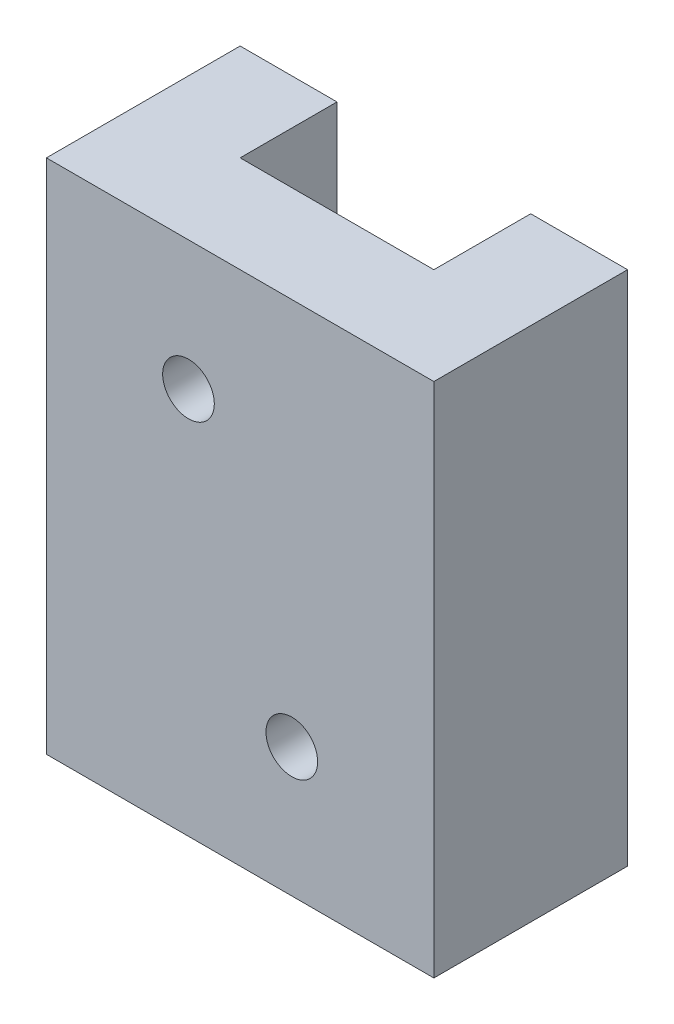
ISO-10303-21;
HEADER;
FILE_DESCRIPTION(('STEP AP214'),'2;1');
FILE_NAME('part.step','',(''),(''),'','','');
FILE_SCHEMA(('AUTOMOTIVE_DESIGN { 1 0 10303 214 1 1 1 1 }'));
ENDSEC;
DATA;
#1=APPLICATION_CONTEXT('core data for automotive mechanical design processes');
#2=APPLICATION_PROTOCOL_DEFINITION('international standard','automotive_design',2000,#1);
#3=PRODUCT_CONTEXT('',#1,'mechanical');
#4=PRODUCT('Part','Part','',(#3));
#5=PRODUCT_RELATED_PRODUCT_CATEGORY('part','',(#4));
#6=PRODUCT_DEFINITION_FORMATION('','',#4);
#7=PRODUCT_DEFINITION_CONTEXT('part definition',#1,'design');
#8=PRODUCT_DEFINITION('design','',#6,#7);
#9=PRODUCT_DEFINITION_SHAPE('','',#8);
#10=(LENGTH_UNIT() NAMED_UNIT(*) SI_UNIT(.MILLI.,.METRE.));
#11=(NAMED_UNIT(*) PLANE_ANGLE_UNIT() SI_UNIT($,.RADIAN.));
#12=(NAMED_UNIT(*) SI_UNIT($,.STERADIAN.) SOLID_ANGLE_UNIT());
#13=UNCERTAINTY_MEASURE_WITH_UNIT(LENGTH_MEASURE(1.E-05),#10,'distance_accuracy_value','');
#14=(GEOMETRIC_REPRESENTATION_CONTEXT(3) GLOBAL_UNCERTAINTY_ASSIGNED_CONTEXT((#13)) GLOBAL_UNIT_ASSIGNED_CONTEXT((#10,
#11,#12)) REPRESENTATION_CONTEXT('',''));
#15=CARTESIAN_POINT('',(0.,0.,0.));
#16=DIRECTION('',(0.,0.,1.));
#17=DIRECTION('',(1.,0.,0.));
#18=AXIS2_PLACEMENT_3D('',#15,#16,#17);
#19=CARTESIAN_POINT('',(0.,0.,0.));
#20=DIRECTION('',(0.,0.,1.));
#21=DIRECTION('',(1.,0.,0.));
#22=AXIS2_PLACEMENT_3D('',#19,#20,#21);
#23=PLANE('',#22);
#24=CARTESIAN_POINT('',(-2.,15.,0.));
#25=DIRECTION('',(0.,0.,1.));
#26=DIRECTION('',(1.,0.,0.));
#27=AXIS2_PLACEMENT_3D('',#24,#25,#26);
#28=CIRCLE('',#27,1.);
#29=CARTESIAN_POINT('',(-1.,15.,0.));
#30=VERTEX_POINT('',#29);
#31=EDGE_CURVE('E149',#30,#30,#28,.T.);
#32=ORIENTED_EDGE('',*,*,#31,.T.);
#33=EDGE_LOOP('',(#32));
#34=FACE_BOUND('',#33,.T.);
#35=CARTESIAN_POINT('',(2.,5.,0.));
#36=DIRECTION('',(0.,0.,1.));
#37=DIRECTION('',(1.,0.,0.));
#38=AXIS2_PLACEMENT_3D('',#35,#36,#37);
#39=CIRCLE('',#38,1.);
#40=CARTESIAN_POINT('',(3.,5.,0.));
#41=VERTEX_POINT('',#40);
#42=EDGE_CURVE('E199',#41,#41,#39,.T.);
#43=ORIENTED_EDGE('',*,*,#42,.T.);
#44=EDGE_LOOP('',(#43));
#45=FACE_BOUND('',#44,.T.);
#46=DIRECTION('',(0.,-1.,0.));
#47=VECTOR('',#46,1.);
#48=CARTESIAN_POINT('',(-3.75,20.,0.));
#49=LINE('',#48,#47);
#50=CARTESIAN_POINT('',(-3.75,20.,0.));
#51=VERTEX_POINT('',#50);
#52=CARTESIAN_POINT('',(-3.75,0.,0.));
#53=VERTEX_POINT('',#52);
#54=EDGE_CURVE('E68',#51,#53,#49,.T.);
#55=ORIENTED_EDGE('',*,*,#54,.F.);
#56=DIRECTION('',(1.,0.,0.));
#57=VECTOR('',#56,1.);
#58=CARTESIAN_POINT('',(0.,20.,0.));
#59=LINE('',#58,#57);
#60=CARTESIAN_POINT('',(3.75,20.,0.));
#61=VERTEX_POINT('',#60);
#62=EDGE_CURVE('E203',#51,#61,#59,.T.);
#63=ORIENTED_EDGE('',*,*,#62,.T.);
#64=DIRECTION('',(0.,1.,0.));
#65=VECTOR('',#64,1.);
#66=CARTESIAN_POINT('',(3.75,20.,0.));
#67=LINE('',#66,#65);
#68=CARTESIAN_POINT('',(3.75,0.,0.));
#69=VERTEX_POINT('',#68);
#70=EDGE_CURVE('E63',#69,#61,#67,.T.);
#71=ORIENTED_EDGE('',*,*,#70,.F.);
#72=DIRECTION('',(1.,0.,0.));
#73=VECTOR('',#72,1.);
#74=CARTESIAN_POINT('',(0.,0.,0.));
#75=LINE('',#74,#73);
#76=EDGE_CURVE('E179',#53,#69,#75,.T.);
#77=ORIENTED_EDGE('',*,*,#76,.F.);
#78=EDGE_LOOP('',(#55,#63,#71,#77));
#79=FACE_BOUND('',#78,.T.);
#80=ADVANCED_FACE('F47',(#34,#45,#79),#23,.F.);
#81=CARTESIAN_POINT('',(0.,20.,3.75));
#82=DIRECTION('',(0.,1.,0.));
#83=DIRECTION('',(0.,0.,1.));
#84=AXIS2_PLACEMENT_3D('',#81,#82,#83);
#85=PLANE('',#84);
#86=ORIENTED_EDGE('',*,*,#62,.F.);
#87=DIRECTION('',(0.,0.,1.));
#88=VECTOR('',#87,1.);
#89=CARTESIAN_POINT('',(-3.75,20.,-3.75));
#90=LINE('',#89,#88);
#91=CARTESIAN_POINT('',(-3.75,20.,-3.75));
#92=VERTEX_POINT('',#91);
#93=EDGE_CURVE('E124',#92,#51,#90,.T.);
#94=ORIENTED_EDGE('',*,*,#93,.F.);
#95=DIRECTION('',(1.,0.,0.));
#96=VECTOR('',#95,1.);
#97=CARTESIAN_POINT('',(-7.5,20.,-3.75));
#98=LINE('',#97,#96);
#99=CARTESIAN_POINT('',(-7.5,20.,-3.75));
#100=VERTEX_POINT('',#99);
#101=EDGE_CURVE('E121',#100,#92,#98,.T.);
#102=ORIENTED_EDGE('',*,*,#101,.F.);
#103=DIRECTION('',(0.,0.,-1.));
#104=VECTOR('',#103,1.);
#105=CARTESIAN_POINT('',(-7.5,20.,3.75));
#106=LINE('',#105,#104);
#107=CARTESIAN_POINT('',(-7.5,20.,3.75));
#108=VERTEX_POINT('',#107);
#109=EDGE_CURVE('E11',#108,#100,#106,.T.);
#110=ORIENTED_EDGE('',*,*,#109,.F.);
#111=DIRECTION('',(1.,0.,0.));
#112=VECTOR('',#111,1.);
#113=CARTESIAN_POINT('',(0.,20.,3.75));
#114=LINE('',#113,#112);
#115=CARTESIAN_POINT('',(7.5,20.,3.75));
#116=VERTEX_POINT('',#115);
#117=EDGE_CURVE('E183',#108,#116,#114,.T.);
#118=ORIENTED_EDGE('',*,*,#117,.T.);
#119=DIRECTION('',(0.,0.,-1.));
#120=VECTOR('',#119,1.);
#121=CARTESIAN_POINT('',(7.5,20.,3.75));
#122=LINE('',#121,#120);
#123=CARTESIAN_POINT('',(7.5,20.,-3.75));
#124=VERTEX_POINT('',#123);
#125=EDGE_CURVE('E195',#116,#124,#122,.T.);
#126=ORIENTED_EDGE('',*,*,#125,.T.);
#127=DIRECTION('',(1.,0.,0.));
#128=VECTOR('',#127,1.);
#129=CARTESIAN_POINT('',(7.5,20.,-3.75));
#130=LINE('',#129,#128);
#131=CARTESIAN_POINT('',(3.75,20.,-3.75));
#132=VERTEX_POINT('',#131);
#133=EDGE_CURVE('E158',#132,#124,#130,.T.);
#134=ORIENTED_EDGE('',*,*,#133,.F.);
#135=DIRECTION('',(0.,0.,1.));
#136=VECTOR('',#135,1.);
#137=CARTESIAN_POINT('',(3.75,20.,-3.75));
#138=LINE('',#137,#136);
#139=EDGE_CURVE('E154',#132,#61,#138,.T.);
#140=ORIENTED_EDGE('',*,*,#139,.T.);
#141=EDGE_LOOP('',(#86,#94,#102,#110,#118,#126,#134,#140));
#142=FACE_BOUND('',#141,.T.);
#143=ADVANCED_FACE('F122',(#142),#85,.T.);
#144=CARTESIAN_POINT('',(-7.5,0.,3.75));
#145=DIRECTION('',(-1.,0.,0.));
#146=DIRECTION('',(0.,0.,1.));
#147=AXIS2_PLACEMENT_3D('',#144,#145,#146);
#148=PLANE('',#147);
#149=ORIENTED_EDGE('',*,*,#109,.T.);
#150=DIRECTION('',(0.,1.,0.));
#151=VECTOR('',#150,1.);
#152=CARTESIAN_POINT('',(-7.5,0.,-3.75));
#153=LINE('',#152,#151);
#154=CARTESIAN_POINT('',(-7.5,0.,-3.75));
#155=VERTEX_POINT('',#154);
#156=EDGE_CURVE('E114',#155,#100,#153,.T.);
#157=ORIENTED_EDGE('',*,*,#156,.F.);
#158=DIRECTION('',(0.,0.,-1.));
#159=VECTOR('',#158,1.);
#160=CARTESIAN_POINT('',(-7.5,0.,3.75));
#161=LINE('',#160,#159);
#162=CARTESIAN_POINT('',(-7.5,0.,3.75));
#163=VERTEX_POINT('',#162);
#164=EDGE_CURVE('E56',#163,#155,#161,.T.);
#165=ORIENTED_EDGE('',*,*,#164,.F.);
#166=DIRECTION('',(0.,1.,0.));
#167=VECTOR('',#166,1.);
#168=CARTESIAN_POINT('',(-7.5,0.,3.75));
#169=LINE('',#168,#167);
#170=EDGE_CURVE('E116',#163,#108,#169,.T.);
#171=ORIENTED_EDGE('',*,*,#170,.T.);
#172=EDGE_LOOP('',(#149,#157,#165,#171));
#173=FACE_BOUND('',#172,.T.);
#174=ADVANCED_FACE('F112',(#173),#148,.T.);
#175=CARTESIAN_POINT('',(0.,0.,3.75));
#176=DIRECTION('',(0.,1.,0.));
#177=DIRECTION('',(-1.,0.,0.));
#178=AXIS2_PLACEMENT_3D('',#175,#176,#177);
#179=PLANE('',#178);
#180=ORIENTED_EDGE('',*,*,#164,.T.);
#181=DIRECTION('',(-1.,0.,0.));
#182=VECTOR('',#181,1.);
#183=CARTESIAN_POINT('',(-3.75,0.,-3.75));
#184=LINE('',#183,#182);
#185=CARTESIAN_POINT('',(-3.75,0.,-3.75));
#186=VERTEX_POINT('',#185);
#187=EDGE_CURVE('E133',#186,#155,#184,.T.);
#188=ORIENTED_EDGE('',*,*,#187,.F.);
#189=DIRECTION('',(0.,0.,1.));
#190=VECTOR('',#189,1.);
#191=CARTESIAN_POINT('',(-3.75,0.,-3.75));
#192=LINE('',#191,#190);
#193=EDGE_CURVE('E142',#186,#53,#192,.T.);
#194=ORIENTED_EDGE('',*,*,#193,.T.);
#195=ORIENTED_EDGE('',*,*,#76,.T.);
#196=DIRECTION('',(0.,0.,1.));
#197=VECTOR('',#196,1.);
#198=CARTESIAN_POINT('',(3.75,0.,-3.75));
#199=LINE('',#198,#197);
#200=CARTESIAN_POINT('',(3.75,0.,-3.75));
#201=VERTEX_POINT('',#200);
#202=EDGE_CURVE('E150',#201,#69,#199,.T.);
#203=ORIENTED_EDGE('',*,*,#202,.F.);
#204=DIRECTION('',(-1.,0.,0.));
#205=VECTOR('',#204,1.);
#206=CARTESIAN_POINT('',(3.75,0.,-3.75));
#207=LINE('',#206,#205);
#208=CARTESIAN_POINT('',(7.5,0.,-3.75));
#209=VERTEX_POINT('',#208);
#210=EDGE_CURVE('E168',#209,#201,#207,.T.);
#211=ORIENTED_EDGE('',*,*,#210,.F.);
#212=DIRECTION('',(0.,0.,-1.));
#213=VECTOR('',#212,1.);
#214=CARTESIAN_POINT('',(7.5,0.,3.75));
#215=LINE('',#214,#213);
#216=CARTESIAN_POINT('',(7.5,0.,3.75));
#217=VERTEX_POINT('',#216);
#218=EDGE_CURVE('E210',#217,#209,#215,.T.);
#219=ORIENTED_EDGE('',*,*,#218,.F.);
#220=DIRECTION('',(1.,0.,0.));
#221=VECTOR('',#220,1.);
#222=CARTESIAN_POINT('',(0.,0.,3.75));
#223=LINE('',#222,#221);
#224=EDGE_CURVE('E188',#163,#217,#223,.T.);
#225=ORIENTED_EDGE('',*,*,#224,.F.);
#226=EDGE_LOOP('',(#180,#188,#194,#195,#203,#211,#219,#225));
#227=FACE_BOUND('',#226,.T.);
#228=ADVANCED_FACE('F215',(#227),#179,.F.);
#229=CARTESIAN_POINT('',(2.,5.,3.75));
#230=DIRECTION('',(0.,0.,-1.));
#231=DIRECTION('',(-1.,0.,0.));
#232=AXIS2_PLACEMENT_3D('',#229,#230,#231);
#233=CYLINDRICAL_SURFACE('',#232,1.);
#234=CARTESIAN_POINT('',(2.,5.,3.75));
#235=DIRECTION('',(0.,0.,1.));
#236=DIRECTION('',(1.,0.,0.));
#237=AXIS2_PLACEMENT_3D('',#234,#235,#236);
#238=CIRCLE('',#237,1.);
#239=CARTESIAN_POINT('',(3.,5.,3.75));
#240=VERTEX_POINT('',#239);
#241=EDGE_CURVE('E178',#240,#240,#238,.T.);
#242=ORIENTED_EDGE('',*,*,#241,.T.);
#243=EDGE_LOOP('',(#242));
#244=FACE_BOUND('',#243,.T.);
#245=ORIENTED_EDGE('',*,*,#42,.F.);
#246=EDGE_LOOP('',(#245));
#247=FACE_BOUND('',#246,.T.);
#248=ADVANCED_FACE('F259',(#244,#247),#233,.F.);
#249=CARTESIAN_POINT('',(-2.,15.,3.75));
#250=DIRECTION('',(0.,0.,-1.));
#251=DIRECTION('',(-1.,0.,0.));
#252=AXIS2_PLACEMENT_3D('',#249,#250,#251);
#253=CYLINDRICAL_SURFACE('',#252,1.);
#254=CARTESIAN_POINT('',(-2.,15.,3.75));
#255=DIRECTION('',(0.,0.,1.));
#256=DIRECTION('',(1.,0.,0.));
#257=AXIS2_PLACEMENT_3D('',#254,#255,#256);
#258=CIRCLE('',#257,1.);
#259=CARTESIAN_POINT('',(-1.,15.,3.75));
#260=VERTEX_POINT('',#259);
#261=EDGE_CURVE('E174',#260,#260,#258,.T.);
#262=ORIENTED_EDGE('',*,*,#261,.T.);
#263=EDGE_LOOP('',(#262));
#264=FACE_BOUND('',#263,.T.);
#265=ORIENTED_EDGE('',*,*,#31,.F.);
#266=EDGE_LOOP('',(#265));
#267=FACE_BOUND('',#266,.T.);
#268=ADVANCED_FACE('F49',(#264,#267),#253,.F.);
#269=CARTESIAN_POINT('',(7.5,0.,3.75));
#270=DIRECTION('',(1.,0.,0.));
#271=DIRECTION('',(0.,0.,-1.));
#272=AXIS2_PLACEMENT_3D('',#269,#270,#271);
#273=PLANE('',#272);
#274=ORIENTED_EDGE('',*,*,#218,.T.);
#275=DIRECTION('',(0.,-1.,0.));
#276=VECTOR('',#275,1.);
#277=CARTESIAN_POINT('',(7.5,0.,-3.75));
#278=LINE('',#277,#276);
#279=EDGE_CURVE('E161',#124,#209,#278,.T.);
#280=ORIENTED_EDGE('',*,*,#279,.F.);
#281=ORIENTED_EDGE('',*,*,#125,.F.);
#282=DIRECTION('',(0.,-1.,0.));
#283=VECTOR('',#282,1.);
#284=CARTESIAN_POINT('',(7.5,0.,3.75));
#285=LINE('',#284,#283);
#286=EDGE_CURVE('E191',#116,#217,#285,.T.);
#287=ORIENTED_EDGE('',*,*,#286,.T.);
#288=EDGE_LOOP('',(#274,#280,#281,#287));
#289=FACE_BOUND('',#288,.T.);
#290=ADVANCED_FACE('F228',(#289),#273,.T.);
#291=CARTESIAN_POINT('',(0.,0.,3.75));
#292=DIRECTION('',(0.,0.,1.));
#293=DIRECTION('',(1.,0.,0.));
#294=AXIS2_PLACEMENT_3D('',#291,#292,#293);
#295=PLANE('',#294);
#296=ORIENTED_EDGE('',*,*,#261,.F.);
#297=EDGE_LOOP('',(#296));
#298=FACE_BOUND('',#297,.T.);
#299=ORIENTED_EDGE('',*,*,#241,.F.);
#300=EDGE_LOOP('',(#299));
#301=FACE_BOUND('',#300,.T.);
#302=ORIENTED_EDGE('',*,*,#117,.F.);
#303=ORIENTED_EDGE('',*,*,#170,.F.);
#304=ORIENTED_EDGE('',*,*,#224,.T.);
#305=ORIENTED_EDGE('',*,*,#286,.F.);
#306=EDGE_LOOP('',(#302,#303,#304,#305));
#307=FACE_BOUND('',#306,.T.);
#308=ADVANCED_FACE('F220',(#298,#301,#307),#295,.T.);
#309=CARTESIAN_POINT('',(3.75,20.,-3.75));
#310=DIRECTION('',(1.,0.,0.));
#311=DIRECTION('',(0.,0.,-1.));
#312=AXIS2_PLACEMENT_3D('',#309,#310,#311);
#313=PLANE('',#312);
#314=ORIENTED_EDGE('',*,*,#70,.T.);
#315=ORIENTED_EDGE('',*,*,#139,.F.);
#316=DIRECTION('',(0.,1.,0.));
#317=VECTOR('',#316,1.);
#318=CARTESIAN_POINT('',(3.75,20.,-3.75));
#319=LINE('',#318,#317);
#320=EDGE_CURVE('E165',#201,#132,#319,.T.);
#321=ORIENTED_EDGE('',*,*,#320,.F.);
#322=ORIENTED_EDGE('',*,*,#202,.T.);
#323=EDGE_LOOP('',(#314,#315,#321,#322));
#324=FACE_BOUND('',#323,.T.);
#325=ADVANCED_FACE('F231',(#324),#313,.F.);
#326=CARTESIAN_POINT('',(0.,0.,-3.75));
#327=DIRECTION('',(0.,0.,1.));
#328=DIRECTION('',(1.,0.,0.));
#329=AXIS2_PLACEMENT_3D('',#326,#327,#328);
#330=PLANE('',#329);
#331=ORIENTED_EDGE('',*,*,#279,.T.);
#332=ORIENTED_EDGE('',*,*,#210,.T.);
#333=ORIENTED_EDGE('',*,*,#320,.T.);
#334=ORIENTED_EDGE('',*,*,#133,.T.);
#335=EDGE_LOOP('',(#331,#332,#333,#334));
#336=FACE_BOUND('',#335,.T.);
#337=ADVANCED_FACE('F225',(#336),#330,.F.);
#338=CARTESIAN_POINT('',(-3.75,20.,-3.75));
#339=DIRECTION('',(-1.,0.,0.));
#340=DIRECTION('',(0.,0.,1.));
#341=AXIS2_PLACEMENT_3D('',#338,#339,#340);
#342=PLANE('',#341);
#343=ORIENTED_EDGE('',*,*,#54,.T.);
#344=ORIENTED_EDGE('',*,*,#193,.F.);
#345=DIRECTION('',(0.,-1.,0.));
#346=VECTOR('',#345,1.);
#347=CARTESIAN_POINT('',(-3.75,20.,-3.75));
#348=LINE('',#347,#346);
#349=EDGE_CURVE('E128',#92,#186,#348,.T.);
#350=ORIENTED_EDGE('',*,*,#349,.F.);
#351=ORIENTED_EDGE('',*,*,#93,.T.);
#352=EDGE_LOOP('',(#343,#344,#350,#351));
#353=FACE_BOUND('',#352,.T.);
#354=ADVANCED_FACE('F233',(#353),#342,.F.);
#355=CARTESIAN_POINT('',(0.,0.,-3.75));
#356=DIRECTION('',(0.,0.,-1.));
#357=DIRECTION('',(-1.,0.,0.));
#358=AXIS2_PLACEMENT_3D('',#355,#356,#357);
#359=PLANE('',#358);
#360=ORIENTED_EDGE('',*,*,#156,.T.);
#361=ORIENTED_EDGE('',*,*,#101,.T.);
#362=ORIENTED_EDGE('',*,*,#349,.T.);
#363=ORIENTED_EDGE('',*,*,#187,.T.);
#364=EDGE_LOOP('',(#360,#361,#362,#363));
#365=FACE_BOUND('',#364,.T.);
#366=ADVANCED_FACE('F131',(#365),#359,.T.);
#367=CLOSED_SHELL('',(#80,#143,#174,#228,#248,#268,#290,#308,#325,#337,#354,#366));
#368=MANIFOLD_SOLID_BREP('B2',#367);
#369=ADVANCED_BREP_SHAPE_REPRESENTATION('',(#18,#368),#14);
#370=SHAPE_DEFINITION_REPRESENTATION(#9,#369);
ENDSEC;
END-ISO-10303-21;
